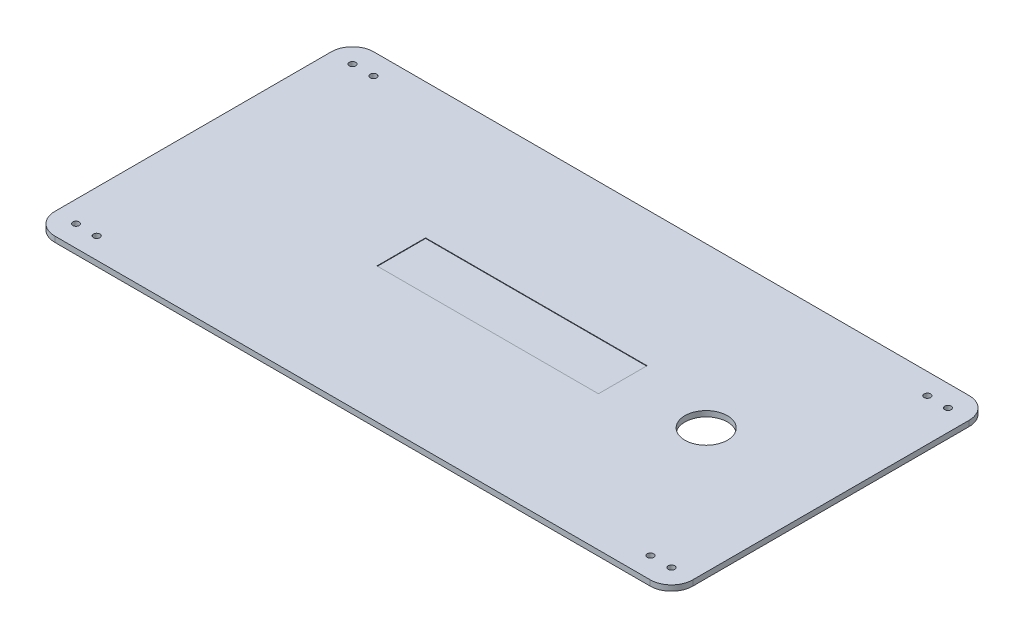
ISO-10303-21;
HEADER;
FILE_DESCRIPTION(('STEP AP214'),'2;1');
FILE_NAME('part.step','',(''),(''),'','','');
FILE_SCHEMA(('AUTOMOTIVE_DESIGN { 1 0 10303 214 1 1 1 1 }'));
ENDSEC;
DATA;
#1=APPLICATION_CONTEXT('core data for automotive mechanical design processes');
#2=APPLICATION_PROTOCOL_DEFINITION('international standard','automotive_design',2000,#1);
#3=PRODUCT_CONTEXT('',#1,'mechanical');
#4=PRODUCT('Part','Part','',(#3));
#5=PRODUCT_RELATED_PRODUCT_CATEGORY('part','',(#4));
#6=PRODUCT_DEFINITION_FORMATION('','',#4);
#7=PRODUCT_DEFINITION_CONTEXT('part definition',#1,'design');
#8=PRODUCT_DEFINITION('design','',#6,#7);
#9=PRODUCT_DEFINITION_SHAPE('','',#8);
#10=(LENGTH_UNIT() NAMED_UNIT(*) SI_UNIT(.MILLI.,.METRE.));
#11=(NAMED_UNIT(*) PLANE_ANGLE_UNIT() SI_UNIT($,.RADIAN.));
#12=(NAMED_UNIT(*) SI_UNIT($,.STERADIAN.) SOLID_ANGLE_UNIT());
#13=UNCERTAINTY_MEASURE_WITH_UNIT(LENGTH_MEASURE(1.E-05),#10,'distance_accuracy_value','');
#14=(GEOMETRIC_REPRESENTATION_CONTEXT(3) GLOBAL_UNCERTAINTY_ASSIGNED_CONTEXT((#13)) GLOBAL_UNIT_ASSIGNED_CONTEXT((#10,
#11,#12)) REPRESENTATION_CONTEXT('',''));
#15=CARTESIAN_POINT('',(0.,0.,0.));
#16=DIRECTION('',(0.,0.,1.));
#17=DIRECTION('',(1.,0.,0.));
#18=AXIS2_PLACEMENT_3D('',#15,#16,#17);
#19=CARTESIAN_POINT('',(0.,2.6,0.));
#20=DIRECTION('',(1.,0.,0.));
#21=DIRECTION('',(0.,0.,-1.));
#22=AXIS2_PLACEMENT_3D('',#19,#20,#21);
#23=PLANE('',#22);
#24=DIRECTION('',(0.,0.,1.));
#25=VECTOR('',#24,1.);
#26=CARTESIAN_POINT('',(0.,2.6,0.));
#27=LINE('',#26,#25);
#28=CARTESIAN_POINT('',(0.,2.6,10.));
#29=VERTEX_POINT('',#28);
#30=CARTESIAN_POINT('',(0.,2.6,140.));
#31=VERTEX_POINT('',#30);
#32=EDGE_CURVE('E221',#29,#31,#27,.T.);
#33=ORIENTED_EDGE('',*,*,#32,.F.);
#34=DIRECTION('',(0.,-1.,0.));
#35=VECTOR('',#34,1.);
#36=CARTESIAN_POINT('',(0.,0.,10.));
#37=LINE('',#36,#35);
#38=CARTESIAN_POINT('',(0.,0.,10.));
#39=VERTEX_POINT('',#38);
#40=EDGE_CURVE('E244',#29,#39,#37,.T.);
#41=ORIENTED_EDGE('',*,*,#40,.T.);
#42=DIRECTION('',(0.,0.,1.));
#43=VECTOR('',#42,1.);
#44=CARTESIAN_POINT('',(0.,0.,0.));
#45=LINE('',#44,#43);
#46=CARTESIAN_POINT('',(0.,0.,140.));
#47=VERTEX_POINT('',#46);
#48=EDGE_CURVE('E218',#39,#47,#45,.T.);
#49=ORIENTED_EDGE('',*,*,#48,.T.);
#50=DIRECTION('',(0.,-1.,0.));
#51=VECTOR('',#50,1.);
#52=CARTESIAN_POINT('',(0.,2.6,140.));
#53=LINE('',#52,#51);
#54=EDGE_CURVE('E232',#47,#31,#53,.F.);
#55=ORIENTED_EDGE('',*,*,#54,.T.);
#56=EDGE_LOOP('',(#33,#41,#49,#55));
#57=FACE_BOUND('',#56,.T.);
#58=ADVANCED_FACE('F37',(#57),#23,.F.);
#59=CARTESIAN_POINT('',(0.,2.6,150.));
#60=DIRECTION('',(0.,0.,-1.));
#61=DIRECTION('',(-1.,0.,0.));
#62=AXIS2_PLACEMENT_3D('',#59,#60,#61);
#63=PLANE('',#62);
#64=DIRECTION('',(1.,0.,0.));
#65=VECTOR('',#64,1.);
#66=CARTESIAN_POINT('',(0.,2.6,150.));
#67=LINE('',#66,#65);
#68=CARTESIAN_POINT('',(10.,2.6,150.));
#69=VERTEX_POINT('',#68);
#70=CARTESIAN_POINT('',(290.,2.6,150.));
#71=VERTEX_POINT('',#70);
#72=EDGE_CURVE('E224',#69,#71,#67,.T.);
#73=ORIENTED_EDGE('',*,*,#72,.F.);
#74=DIRECTION('',(0.,-1.,0.));
#75=VECTOR('',#74,1.);
#76=CARTESIAN_POINT('',(10.,2.6,150.));
#77=LINE('',#76,#75);
#78=CARTESIAN_POINT('',(10.,0.,150.));
#79=VERTEX_POINT('',#78);
#80=EDGE_CURVE('E269',#69,#79,#77,.T.);
#81=ORIENTED_EDGE('',*,*,#80,.T.);
#82=DIRECTION('',(1.,0.,0.));
#83=VECTOR('',#82,1.);
#84=CARTESIAN_POINT('',(0.,0.,150.));
#85=LINE('',#84,#83);
#86=CARTESIAN_POINT('',(290.,0.,150.));
#87=VERTEX_POINT('',#86);
#88=EDGE_CURVE('E235',#79,#87,#85,.T.);
#89=ORIENTED_EDGE('',*,*,#88,.T.);
#90=DIRECTION('',(0.,-1.,0.));
#91=VECTOR('',#90,1.);
#92=CARTESIAN_POINT('',(290.,2.6,150.));
#93=LINE('',#92,#91);
#94=EDGE_CURVE('E267',#87,#71,#93,.F.);
#95=ORIENTED_EDGE('',*,*,#94,.T.);
#96=EDGE_LOOP('',(#73,#81,#89,#95));
#97=FACE_BOUND('',#96,.T.);
#98=ADVANCED_FACE('F302',(#97),#63,.F.);
#99=CARTESIAN_POINT('',(300.,2.6,0.));
#100=DIRECTION('',(1.,0.,0.));
#101=DIRECTION('',(0.,0.,-1.));
#102=AXIS2_PLACEMENT_3D('',#99,#100,#101);
#103=PLANE('',#102);
#104=DIRECTION('',(0.,0.,1.));
#105=VECTOR('',#104,1.);
#106=CARTESIAN_POINT('',(300.,2.6,0.));
#107=LINE('',#106,#105);
#108=CARTESIAN_POINT('',(300.,2.6,10.));
#109=VERTEX_POINT('',#108);
#110=CARTESIAN_POINT('',(300.,2.6,140.));
#111=VERTEX_POINT('',#110);
#112=EDGE_CURVE('E227',#109,#111,#107,.T.);
#113=ORIENTED_EDGE('',*,*,#112,.T.);
#114=DIRECTION('',(0.,-1.,0.));
#115=VECTOR('',#114,1.);
#116=CARTESIAN_POINT('',(300.,0.,140.));
#117=LINE('',#116,#115);
#118=CARTESIAN_POINT('',(300.,0.,140.));
#119=VERTEX_POINT('',#118);
#120=EDGE_CURVE('E11',#111,#119,#117,.T.);
#121=ORIENTED_EDGE('',*,*,#120,.T.);
#122=DIRECTION('',(0.,0.,1.));
#123=VECTOR('',#122,1.);
#124=CARTESIAN_POINT('',(300.,0.,0.));
#125=LINE('',#124,#123);
#126=CARTESIAN_POINT('',(300.,0.,10.));
#127=VERTEX_POINT('',#126);
#128=EDGE_CURVE('E238',#127,#119,#125,.T.);
#129=ORIENTED_EDGE('',*,*,#128,.F.);
#130=DIRECTION('',(0.,-1.,0.));
#131=VECTOR('',#130,1.);
#132=CARTESIAN_POINT('',(300.,2.6,10.));
#133=LINE('',#132,#131);
#134=EDGE_CURVE('E45',#127,#109,#133,.F.);
#135=ORIENTED_EDGE('',*,*,#134,.T.);
#136=EDGE_LOOP('',(#113,#121,#129,#135));
#137=FACE_BOUND('',#136,.T.);
#138=ADVANCED_FACE('F274',(#137),#103,.T.);
#139=CARTESIAN_POINT('',(0.,2.6,0.));
#140=DIRECTION('',(0.,0.,-1.));
#141=DIRECTION('',(-1.,0.,0.));
#142=AXIS2_PLACEMENT_3D('',#139,#140,#141);
#143=PLANE('',#142);
#144=DIRECTION('',(1.,0.,0.));
#145=VECTOR('',#144,1.);
#146=CARTESIAN_POINT('',(0.,0.,0.));
#147=LINE('',#146,#145);
#148=CARTESIAN_POINT('',(10.,0.,0.));
#149=VERTEX_POINT('',#148);
#150=CARTESIAN_POINT('',(290.,0.,0.));
#151=VERTEX_POINT('',#150);
#152=EDGE_CURVE('E225',#149,#151,#147,.T.);
#153=ORIENTED_EDGE('',*,*,#152,.F.);
#154=DIRECTION('',(0.,-1.,0.));
#155=VECTOR('',#154,1.);
#156=CARTESIAN_POINT('',(10.,2.6,0.));
#157=LINE('',#156,#155);
#158=CARTESIAN_POINT('',(10.,2.6,0.));
#159=VERTEX_POINT('',#158);
#160=EDGE_CURVE('E258',#149,#159,#157,.F.);
#161=ORIENTED_EDGE('',*,*,#160,.T.);
#162=DIRECTION('',(1.,0.,0.));
#163=VECTOR('',#162,1.);
#164=CARTESIAN_POINT('',(0.,2.6,0.));
#165=LINE('',#164,#163);
#166=CARTESIAN_POINT('',(290.,2.6,0.));
#167=VERTEX_POINT('',#166);
#168=EDGE_CURVE('E229',#159,#167,#165,.T.);
#169=ORIENTED_EDGE('',*,*,#168,.T.);
#170=DIRECTION('',(0.,-1.,0.));
#171=VECTOR('',#170,1.);
#172=CARTESIAN_POINT('',(290.,2.6,0.));
#173=LINE('',#172,#171);
#174=EDGE_CURVE('E255',#167,#151,#173,.T.);
#175=ORIENTED_EDGE('',*,*,#174,.T.);
#176=EDGE_LOOP('',(#153,#161,#169,#175));
#177=FACE_BOUND('',#176,.T.);
#178=ADVANCED_FACE('F283',(#177),#143,.T.);
#179=CARTESIAN_POINT('',(0.,2.6,0.));
#180=DIRECTION('',(0.,1.,0.));
#181=DIRECTION('',(0.,0.,1.));
#182=AXIS2_PLACEMENT_3D('',#179,#180,#181);
#183=PLANE('',#182);
#184=DIRECTION('',(0.,0.,-1.));
#185=VECTOR('',#184,1.);
#186=CARTESIAN_POINT('',(202.07,2.6,86.43));
#187=LINE('',#186,#185);
#188=CARTESIAN_POINT('',(202.07,2.6,86.43));
#189=VERTEX_POINT('',#188);
#190=CARTESIAN_POINT('',(202.07,2.6,63.57));
#191=VERTEX_POINT('',#190);
#192=EDGE_CURVE('E52',#189,#191,#187,.T.);
#193=ORIENTED_EDGE('',*,*,#192,.F.);
#194=DIRECTION('',(1.,0.,0.));
#195=VECTOR('',#194,1.);
#196=CARTESIAN_POINT('',(97.93,2.6,86.43));
#197=LINE('',#196,#195);
#198=CARTESIAN_POINT('',(97.93,2.6,86.43));
#199=VERTEX_POINT('',#198);
#200=EDGE_CURVE('E148',#199,#189,#197,.T.);
#201=ORIENTED_EDGE('',*,*,#200,.F.);
#202=DIRECTION('',(0.,0.,1.));
#203=VECTOR('',#202,1.);
#204=CARTESIAN_POINT('',(97.93,2.6,86.43));
#205=LINE('',#204,#203);
#206=CARTESIAN_POINT('',(97.93,2.6,63.57));
#207=VERTEX_POINT('',#206);
#208=EDGE_CURVE('E151',#207,#199,#205,.T.);
#209=ORIENTED_EDGE('',*,*,#208,.F.);
#210=DIRECTION('',(-1.,0.,0.));
#211=VECTOR('',#210,1.);
#212=CARTESIAN_POINT('',(97.93,2.6,63.57));
#213=LINE('',#212,#211);
#214=EDGE_CURVE('E157',#191,#207,#213,.T.);
#215=ORIENTED_EDGE('',*,*,#214,.F.);
#216=EDGE_LOOP('',(#193,#201,#209,#215));
#217=FACE_BOUND('',#216,.T.);
#218=CARTESIAN_POINT('',(241.3,2.6,75.));
#219=DIRECTION('',(0.,-1.,0.));
#220=DIRECTION('',(0.,0.,-1.));
#221=AXIS2_PLACEMENT_3D('',#218,#219,#220);
#222=CIRCLE('',#221,10.0000000000001);
#223=CARTESIAN_POINT('',(241.3,2.6,64.9999999999999));
#224=VERTEX_POINT('',#223);
#225=EDGE_CURVE('E167',#224,#224,#222,.T.);
#226=ORIENTED_EDGE('',*,*,#225,.T.);
#227=EDGE_LOOP('',(#226));
#228=FACE_BOUND('',#227,.T.);
#229=CARTESIAN_POINT('',(19.812,2.6,140.094));
#230=DIRECTION('',(0.,-1.,0.));
#231=DIRECTION('',(0.,0.,-1.));
#232=AXIS2_PLACEMENT_3D('',#229,#230,#231);
#233=CIRCLE('',#232,1.524);
#234=CARTESIAN_POINT('',(19.812,2.6,138.57));
#235=VERTEX_POINT('',#234);
#236=EDGE_CURVE('E170',#235,#235,#233,.T.);
#237=ORIENTED_EDGE('',*,*,#236,.T.);
#238=EDGE_LOOP('',(#237));
#239=FACE_BOUND('',#238,.T.);
#240=CARTESIAN_POINT('',(280.188,2.6,140.094));
#241=DIRECTION('',(0.,1.,0.));
#242=DIRECTION('',(0.,0.,-1.));
#243=AXIS2_PLACEMENT_3D('',#240,#241,#242);
#244=CIRCLE('',#243,1.524);
#245=CARTESIAN_POINT('',(280.188,2.6,138.57));
#246=VERTEX_POINT('',#245);
#247=EDGE_CURVE('E176',#246,#246,#244,.T.);
#248=ORIENTED_EDGE('',*,*,#247,.F.);
#249=EDGE_LOOP('',(#248));
#250=FACE_BOUND('',#249,.T.);
#251=CARTESIAN_POINT('',(280.188,2.6,9.90599999999998));
#252=DIRECTION('',(0.,-1.,0.));
#253=DIRECTION('',(0.,0.,1.));
#254=AXIS2_PLACEMENT_3D('',#251,#252,#253);
#255=CIRCLE('',#254,1.524);
#256=CARTESIAN_POINT('',(280.188,2.6,11.43));
#257=VERTEX_POINT('',#256);
#258=EDGE_CURVE('E182',#257,#257,#255,.T.);
#259=ORIENTED_EDGE('',*,*,#258,.T.);
#260=EDGE_LOOP('',(#259));
#261=FACE_BOUND('',#260,.T.);
#262=CARTESIAN_POINT('',(19.812,2.6,9.906));
#263=DIRECTION('',(0.,1.,0.));
#264=DIRECTION('',(0.,0.,1.));
#265=AXIS2_PLACEMENT_3D('',#262,#263,#264);
#266=CIRCLE('',#265,1.524);
#267=CARTESIAN_POINT('',(19.812,2.6,11.43));
#268=VERTEX_POINT('',#267);
#269=EDGE_CURVE('E188',#268,#268,#266,.T.);
#270=ORIENTED_EDGE('',*,*,#269,.F.);
#271=EDGE_LOOP('',(#270));
#272=FACE_BOUND('',#271,.T.);
#273=CARTESIAN_POINT('',(290.,2.6,140.));
#274=DIRECTION('',(0.,1.,0.));
#275=DIRECTION('',(0.,0.,1.));
#276=AXIS2_PLACEMENT_3D('',#273,#274,#275);
#277=CIRCLE('',#276,1.50000000000002);
#278=CARTESIAN_POINT('',(290.,2.6,141.5));
#279=VERTEX_POINT('',#278);
#280=EDGE_CURVE('E197',#279,#279,#277,.T.);
#281=ORIENTED_EDGE('',*,*,#280,.F.);
#282=EDGE_LOOP('',(#281));
#283=FACE_BOUND('',#282,.T.);
#284=CARTESIAN_POINT('',(10.,2.6,140.));
#285=DIRECTION('',(0.,-1.,0.));
#286=DIRECTION('',(0.,0.,1.));
#287=AXIS2_PLACEMENT_3D('',#284,#285,#286);
#288=CIRCLE('',#287,1.50000000000002);
#289=CARTESIAN_POINT('',(10.,2.6,141.5));
#290=VERTEX_POINT('',#289);
#291=EDGE_CURVE('E203',#290,#290,#288,.T.);
#292=ORIENTED_EDGE('',*,*,#291,.T.);
#293=EDGE_LOOP('',(#292));
#294=FACE_BOUND('',#293,.T.);
#295=CARTESIAN_POINT('',(10.,2.6,10.));
#296=DIRECTION('',(0.,1.,0.));
#297=DIRECTION('',(0.,0.,-1.));
#298=AXIS2_PLACEMENT_3D('',#295,#296,#297);
#299=CIRCLE('',#298,1.50000000000002);
#300=CARTESIAN_POINT('',(10.,2.6,8.49999999999999));
#301=VERTEX_POINT('',#300);
#302=EDGE_CURVE('E209',#301,#301,#299,.T.);
#303=ORIENTED_EDGE('',*,*,#302,.F.);
#304=EDGE_LOOP('',(#303));
#305=FACE_BOUND('',#304,.T.);
#306=CARTESIAN_POINT('',(290.,2.6,10.));
#307=DIRECTION('',(0.,-1.,0.));
#308=DIRECTION('',(0.,0.,-1.));
#309=AXIS2_PLACEMENT_3D('',#306,#307,#308);
#310=CIRCLE('',#309,1.50000000000002);
#311=CARTESIAN_POINT('',(290.,2.6,8.49999999999998));
#312=VERTEX_POINT('',#311);
#313=EDGE_CURVE('E215',#312,#312,#310,.T.);
#314=ORIENTED_EDGE('',*,*,#313,.T.);
#315=EDGE_LOOP('',(#314));
#316=FACE_BOUND('',#315,.T.);
#317=ORIENTED_EDGE('',*,*,#168,.F.);
#318=CARTESIAN_POINT('',(10.,2.6,10.));
#319=DIRECTION('',(0.,1.,0.));
#320=DIRECTION('',(0.,0.,1.));
#321=AXIS2_PLACEMENT_3D('',#318,#319,#320);
#322=CIRCLE('',#321,10.);
#323=EDGE_CURVE('E265',#159,#29,#322,.T.);
#324=ORIENTED_EDGE('',*,*,#323,.T.);
#325=ORIENTED_EDGE('',*,*,#32,.T.);
#326=CARTESIAN_POINT('',(10.,2.6,140.));
#327=DIRECTION('',(0.,1.,0.));
#328=DIRECTION('',(0.,0.,1.));
#329=AXIS2_PLACEMENT_3D('',#326,#327,#328);
#330=CIRCLE('',#329,10.);
#331=EDGE_CURVE('E263',#31,#69,#330,.T.);
#332=ORIENTED_EDGE('',*,*,#331,.T.);
#333=ORIENTED_EDGE('',*,*,#72,.T.);
#334=CARTESIAN_POINT('',(290.,2.6,140.));
#335=DIRECTION('',(0.,1.,0.));
#336=DIRECTION('',(0.,0.,1.));
#337=AXIS2_PLACEMENT_3D('',#334,#335,#336);
#338=CIRCLE('',#337,10.);
#339=EDGE_CURVE('E60',#71,#111,#338,.T.);
#340=ORIENTED_EDGE('',*,*,#339,.T.);
#341=ORIENTED_EDGE('',*,*,#112,.F.);
#342=CARTESIAN_POINT('',(290.,2.6,10.));
#343=DIRECTION('',(0.,1.,0.));
#344=DIRECTION('',(0.,0.,1.));
#345=AXIS2_PLACEMENT_3D('',#342,#343,#344);
#346=CIRCLE('',#345,10.);
#347=EDGE_CURVE('E260',#109,#167,#346,.T.);
#348=ORIENTED_EDGE('',*,*,#347,.T.);
#349=EDGE_LOOP('',(#317,#324,#325,#332,#333,#340,#341,#348));
#350=FACE_BOUND('',#349,.T.);
#351=ADVANCED_FACE('F279',(#217,#228,#239,#250,#261,#272,#283,#294,#305,#316,#350),#183,.T.);
#352=CARTESIAN_POINT('',(0.,0.,0.));
#353=DIRECTION('',(0.,1.,0.));
#354=DIRECTION('',(0.,0.,1.));
#355=AXIS2_PLACEMENT_3D('',#352,#353,#354);
#356=PLANE('',#355);
#357=CARTESIAN_POINT('',(241.3,0.,75.));
#358=DIRECTION('',(0.,-1.,0.));
#359=DIRECTION('',(0.,0.,-1.));
#360=AXIS2_PLACEMENT_3D('',#357,#358,#359);
#361=CIRCLE('',#360,10.0000000000001);
#362=CARTESIAN_POINT('',(241.3,0.,64.9999999999999));
#363=VERTEX_POINT('',#362);
#364=EDGE_CURVE('E163',#363,#363,#361,.T.);
#365=ORIENTED_EDGE('',*,*,#364,.F.);
#366=EDGE_LOOP('',(#365));
#367=FACE_BOUND('',#366,.T.);
#368=CARTESIAN_POINT('',(19.812,1.19999999954185E-07,140.094));
#369=DIRECTION('',(0.,-1.,0.));
#370=DIRECTION('',(0.,0.,-1.));
#371=AXIS2_PLACEMENT_3D('',#368,#369,#370);
#372=CIRCLE('',#371,1.524);
#373=CARTESIAN_POINT('',(19.812,1.19999999954185E-07,138.57));
#374=VERTEX_POINT('',#373);
#375=EDGE_CURVE('E173',#374,#374,#372,.T.);
#376=ORIENTED_EDGE('',*,*,#375,.F.);
#377=EDGE_LOOP('',(#376));
#378=FACE_BOUND('',#377,.T.);
#379=CARTESIAN_POINT('',(280.188,1.19999999954185E-07,140.094));
#380=DIRECTION('',(0.,1.,0.));
#381=DIRECTION('',(0.,0.,-1.));
#382=AXIS2_PLACEMENT_3D('',#379,#380,#381);
#383=CIRCLE('',#382,1.524);
#384=CARTESIAN_POINT('',(280.188,1.19999999954185E-07,138.57));
#385=VERTEX_POINT('',#384);
#386=EDGE_CURVE('E179',#385,#385,#383,.T.);
#387=ORIENTED_EDGE('',*,*,#386,.T.);
#388=EDGE_LOOP('',(#387));
#389=FACE_BOUND('',#388,.T.);
#390=CARTESIAN_POINT('',(280.188,1.19999999954185E-07,9.90599999999998));
#391=DIRECTION('',(0.,-1.,0.));
#392=DIRECTION('',(0.,0.,1.));
#393=AXIS2_PLACEMENT_3D('',#390,#391,#392);
#394=CIRCLE('',#393,1.524);
#395=CARTESIAN_POINT('',(280.188,1.19999999954185E-07,11.43));
#396=VERTEX_POINT('',#395);
#397=EDGE_CURVE('E185',#396,#396,#394,.T.);
#398=ORIENTED_EDGE('',*,*,#397,.F.);
#399=EDGE_LOOP('',(#398));
#400=FACE_BOUND('',#399,.T.);
#401=CARTESIAN_POINT('',(19.812,1.19999999954185E-07,9.906));
#402=DIRECTION('',(0.,1.,0.));
#403=DIRECTION('',(0.,0.,1.));
#404=AXIS2_PLACEMENT_3D('',#401,#402,#403);
#405=CIRCLE('',#404,1.524);
#406=CARTESIAN_POINT('',(19.812,1.19999999954185E-07,11.43));
#407=VERTEX_POINT('',#406);
#408=EDGE_CURVE('E191',#407,#407,#405,.T.);
#409=ORIENTED_EDGE('',*,*,#408,.T.);
#410=EDGE_LOOP('',(#409));
#411=FACE_BOUND('',#410,.T.);
#412=CARTESIAN_POINT('',(290.,0.,140.));
#413=DIRECTION('',(0.,1.,0.));
#414=DIRECTION('',(0.,0.,1.));
#415=AXIS2_PLACEMENT_3D('',#412,#413,#414);
#416=CIRCLE('',#415,1.50000000000002);
#417=CARTESIAN_POINT('',(290.,0.,141.5));
#418=VERTEX_POINT('',#417);
#419=EDGE_CURVE('E194',#418,#418,#416,.T.);
#420=ORIENTED_EDGE('',*,*,#419,.T.);
#421=EDGE_LOOP('',(#420));
#422=FACE_BOUND('',#421,.T.);
#423=CARTESIAN_POINT('',(10.,0.,140.));
#424=DIRECTION('',(0.,-1.,0.));
#425=DIRECTION('',(0.,0.,1.));
#426=AXIS2_PLACEMENT_3D('',#423,#424,#425);
#427=CIRCLE('',#426,1.50000000000002);
#428=CARTESIAN_POINT('',(10.,0.,141.5));
#429=VERTEX_POINT('',#428);
#430=EDGE_CURVE('E200',#429,#429,#427,.T.);
#431=ORIENTED_EDGE('',*,*,#430,.F.);
#432=EDGE_LOOP('',(#431));
#433=FACE_BOUND('',#432,.T.);
#434=CARTESIAN_POINT('',(10.,0.,10.));
#435=DIRECTION('',(0.,1.,0.));
#436=DIRECTION('',(0.,0.,-1.));
#437=AXIS2_PLACEMENT_3D('',#434,#435,#436);
#438=CIRCLE('',#437,1.50000000000002);
#439=CARTESIAN_POINT('',(10.,0.,8.49999999999999));
#440=VERTEX_POINT('',#439);
#441=EDGE_CURVE('E206',#440,#440,#438,.T.);
#442=ORIENTED_EDGE('',*,*,#441,.T.);
#443=EDGE_LOOP('',(#442));
#444=FACE_BOUND('',#443,.T.);
#445=CARTESIAN_POINT('',(290.,0.,10.));
#446=DIRECTION('',(0.,-1.,0.));
#447=DIRECTION('',(0.,0.,-1.));
#448=AXIS2_PLACEMENT_3D('',#445,#446,#447);
#449=CIRCLE('',#448,1.50000000000002);
#450=CARTESIAN_POINT('',(290.,0.,8.49999999999998));
#451=VERTEX_POINT('',#450);
#452=EDGE_CURVE('E212',#451,#451,#449,.T.);
#453=ORIENTED_EDGE('',*,*,#452,.F.);
#454=EDGE_LOOP('',(#453));
#455=FACE_BOUND('',#454,.T.);
#456=ORIENTED_EDGE('',*,*,#48,.F.);
#457=CARTESIAN_POINT('',(10.,0.,10.));
#458=DIRECTION('',(0.,1.,0.));
#459=DIRECTION('',(0.,0.,1.));
#460=AXIS2_PLACEMENT_3D('',#457,#458,#459);
#461=CIRCLE('',#460,10.);
#462=EDGE_CURVE('E253',#39,#149,#461,.F.);
#463=ORIENTED_EDGE('',*,*,#462,.T.);
#464=ORIENTED_EDGE('',*,*,#152,.T.);
#465=CARTESIAN_POINT('',(290.,0.,10.));
#466=DIRECTION('',(0.,1.,0.));
#467=DIRECTION('',(0.,0.,1.));
#468=AXIS2_PLACEMENT_3D('',#465,#466,#467);
#469=CIRCLE('',#468,10.);
#470=EDGE_CURVE('E247',#151,#127,#469,.F.);
#471=ORIENTED_EDGE('',*,*,#470,.T.);
#472=ORIENTED_EDGE('',*,*,#128,.T.);
#473=CARTESIAN_POINT('',(290.,0.,140.));
#474=DIRECTION('',(0.,1.,0.));
#475=DIRECTION('',(0.,0.,1.));
#476=AXIS2_PLACEMENT_3D('',#473,#474,#475);
#477=CIRCLE('',#476,10.);
#478=EDGE_CURVE('E249',#119,#87,#477,.F.);
#479=ORIENTED_EDGE('',*,*,#478,.T.);
#480=ORIENTED_EDGE('',*,*,#88,.F.);
#481=CARTESIAN_POINT('',(10.,0.,140.));
#482=DIRECTION('',(0.,1.,0.));
#483=DIRECTION('',(0.,0.,1.));
#484=AXIS2_PLACEMENT_3D('',#481,#482,#483);
#485=CIRCLE('',#484,10.);
#486=EDGE_CURVE('E251',#79,#47,#485,.F.);
#487=ORIENTED_EDGE('',*,*,#486,.T.);
#488=EDGE_LOOP('',(#456,#463,#464,#471,#472,#479,#480,#487));
#489=FACE_BOUND('',#488,.T.);
#490=ADVANCED_FACE('F287',(#367,#378,#389,#400,#411,#422,#433,#444,#455,#489),#356,.F.);
#491=CARTESIAN_POINT('',(10.,2.6,10.));
#492=DIRECTION('',(0.,1.,0.));
#493=DIRECTION('',(0.,0.,1.));
#494=AXIS2_PLACEMENT_3D('',#491,#492,#493);
#495=CYLINDRICAL_SURFACE('',#494,10.);
#496=ORIENTED_EDGE('',*,*,#323,.F.);
#497=ORIENTED_EDGE('',*,*,#160,.F.);
#498=ORIENTED_EDGE('',*,*,#462,.F.);
#499=ORIENTED_EDGE('',*,*,#40,.F.);
#500=EDGE_LOOP('',(#496,#497,#498,#499));
#501=FACE_BOUND('',#500,.T.);
#502=ADVANCED_FACE('F291',(#501),#495,.T.);
#503=CARTESIAN_POINT('',(10.,2.6,140.));
#504=DIRECTION('',(0.,-1.,0.));
#505=DIRECTION('',(0.,0.,-1.));
#506=AXIS2_PLACEMENT_3D('',#503,#504,#505);
#507=CYLINDRICAL_SURFACE('',#506,10.);
#508=ORIENTED_EDGE('',*,*,#331,.F.);
#509=ORIENTED_EDGE('',*,*,#54,.F.);
#510=ORIENTED_EDGE('',*,*,#486,.F.);
#511=ORIENTED_EDGE('',*,*,#80,.F.);
#512=EDGE_LOOP('',(#508,#509,#510,#511));
#513=FACE_BOUND('',#512,.T.);
#514=ADVANCED_FACE('F299',(#513),#507,.T.);
#515=CARTESIAN_POINT('',(290.,2.6,140.));
#516=DIRECTION('',(0.,1.,0.));
#517=DIRECTION('',(0.,0.,1.));
#518=AXIS2_PLACEMENT_3D('',#515,#516,#517);
#519=CYLINDRICAL_SURFACE('',#518,10.);
#520=ORIENTED_EDGE('',*,*,#339,.F.);
#521=ORIENTED_EDGE('',*,*,#94,.F.);
#522=ORIENTED_EDGE('',*,*,#478,.F.);
#523=ORIENTED_EDGE('',*,*,#120,.F.);
#524=EDGE_LOOP('',(#520,#521,#522,#523));
#525=FACE_BOUND('',#524,.T.);
#526=ADVANCED_FACE('F305',(#525),#519,.T.);
#527=CARTESIAN_POINT('',(290.,2.6,10.));
#528=DIRECTION('',(0.,-1.,0.));
#529=DIRECTION('',(0.,0.,-1.));
#530=AXIS2_PLACEMENT_3D('',#527,#528,#529);
#531=CYLINDRICAL_SURFACE('',#530,10.);
#532=ORIENTED_EDGE('',*,*,#347,.F.);
#533=ORIENTED_EDGE('',*,*,#134,.F.);
#534=ORIENTED_EDGE('',*,*,#470,.F.);
#535=ORIENTED_EDGE('',*,*,#174,.F.);
#536=EDGE_LOOP('',(#532,#533,#534,#535));
#537=FACE_BOUND('',#536,.T.);
#538=ADVANCED_FACE('F39',(#537),#531,.T.);
#539=CARTESIAN_POINT('',(290.,2.6,10.));
#540=DIRECTION('',(0.,-1.,0.));
#541=DIRECTION('',(0.,0.,-1.));
#542=AXIS2_PLACEMENT_3D('',#539,#540,#541);
#543=CYLINDRICAL_SURFACE('',#542,1.50000000000002);
#544=ORIENTED_EDGE('',*,*,#313,.F.);
#545=EDGE_LOOP('',(#544));
#546=FACE_BOUND('',#545,.T.);
#547=ORIENTED_EDGE('',*,*,#452,.T.);
#548=EDGE_LOOP('',(#547));
#549=FACE_BOUND('',#548,.T.);
#550=ADVANCED_FACE('F311',(#546,#549),#543,.F.);
#551=CARTESIAN_POINT('',(10.,2.6,10.));
#552=DIRECTION('',(0.,-1.,0.));
#553=DIRECTION('',(0.,0.,-1.));
#554=AXIS2_PLACEMENT_3D('',#551,#552,#553);
#555=CYLINDRICAL_SURFACE('',#554,1.50000000000002);
#556=ORIENTED_EDGE('',*,*,#302,.T.);
#557=EDGE_LOOP('',(#556));
#558=FACE_BOUND('',#557,.T.);
#559=ORIENTED_EDGE('',*,*,#441,.F.);
#560=EDGE_LOOP('',(#559));
#561=FACE_BOUND('',#560,.T.);
#562=ADVANCED_FACE('F430',(#558,#561),#555,.F.);
#563=CARTESIAN_POINT('',(10.,2.6,140.));
#564=DIRECTION('',(0.,-1.,0.));
#565=DIRECTION('',(0.,0.,-1.));
#566=AXIS2_PLACEMENT_3D('',#563,#564,#565);
#567=CYLINDRICAL_SURFACE('',#566,1.50000000000002);
#568=ORIENTED_EDGE('',*,*,#291,.F.);
#569=EDGE_LOOP('',(#568));
#570=FACE_BOUND('',#569,.T.);
#571=ORIENTED_EDGE('',*,*,#430,.T.);
#572=EDGE_LOOP('',(#571));
#573=FACE_BOUND('',#572,.T.);
#574=ADVANCED_FACE('F426',(#570,#573),#567,.F.);
#575=CARTESIAN_POINT('',(290.,2.6,140.));
#576=DIRECTION('',(0.,-1.,0.));
#577=DIRECTION('',(0.,0.,-1.));
#578=AXIS2_PLACEMENT_3D('',#575,#576,#577);
#579=CYLINDRICAL_SURFACE('',#578,1.50000000000002);
#580=ORIENTED_EDGE('',*,*,#280,.T.);
#581=EDGE_LOOP('',(#580));
#582=FACE_BOUND('',#581,.T.);
#583=ORIENTED_EDGE('',*,*,#419,.F.);
#584=EDGE_LOOP('',(#583));
#585=FACE_BOUND('',#584,.T.);
#586=ADVANCED_FACE('F422',(#582,#585),#579,.F.);
#587=CARTESIAN_POINT('',(19.812,1.19999999954185E-07,9.906));
#588=DIRECTION('',(0.,1.,0.));
#589=DIRECTION('',(0.,0.,1.));
#590=AXIS2_PLACEMENT_3D('',#587,#588,#589);
#591=CYLINDRICAL_SURFACE('',#590,1.524);
#592=ORIENTED_EDGE('',*,*,#408,.F.);
#593=EDGE_LOOP('',(#592));
#594=FACE_BOUND('',#593,.T.);
#595=ORIENTED_EDGE('',*,*,#269,.T.);
#596=EDGE_LOOP('',(#595));
#597=FACE_BOUND('',#596,.T.);
#598=ADVANCED_FACE('F418',(#594,#597),#591,.F.);
#599=CARTESIAN_POINT('',(280.188,1.19999999954185E-07,9.90599999999998));
#600=DIRECTION('',(0.,1.,0.));
#601=DIRECTION('',(0.,0.,1.));
#602=AXIS2_PLACEMENT_3D('',#599,#600,#601);
#603=CYLINDRICAL_SURFACE('',#602,1.524);
#604=ORIENTED_EDGE('',*,*,#397,.T.);
#605=EDGE_LOOP('',(#604));
#606=FACE_BOUND('',#605,.T.);
#607=ORIENTED_EDGE('',*,*,#258,.F.);
#608=EDGE_LOOP('',(#607));
#609=FACE_BOUND('',#608,.T.);
#610=ADVANCED_FACE('F414',(#606,#609),#603,.F.);
#611=CARTESIAN_POINT('',(280.188,1.19999999954185E-07,140.094));
#612=DIRECTION('',(0.,1.,0.));
#613=DIRECTION('',(0.,0.,1.));
#614=AXIS2_PLACEMENT_3D('',#611,#612,#613);
#615=CYLINDRICAL_SURFACE('',#614,1.524);
#616=ORIENTED_EDGE('',*,*,#386,.F.);
#617=EDGE_LOOP('',(#616));
#618=FACE_BOUND('',#617,.T.);
#619=ORIENTED_EDGE('',*,*,#247,.T.);
#620=EDGE_LOOP('',(#619));
#621=FACE_BOUND('',#620,.T.);
#622=ADVANCED_FACE('F410',(#618,#621),#615,.F.);
#623=CARTESIAN_POINT('',(19.812,1.19999999954185E-07,140.094));
#624=DIRECTION('',(0.,1.,0.));
#625=DIRECTION('',(0.,0.,1.));
#626=AXIS2_PLACEMENT_3D('',#623,#624,#625);
#627=CYLINDRICAL_SURFACE('',#626,1.524);
#628=ORIENTED_EDGE('',*,*,#375,.T.);
#629=EDGE_LOOP('',(#628));
#630=FACE_BOUND('',#629,.T.);
#631=ORIENTED_EDGE('',*,*,#236,.F.);
#632=EDGE_LOOP('',(#631));
#633=FACE_BOUND('',#632,.T.);
#634=ADVANCED_FACE('F406',(#630,#633),#627,.F.);
#635=CARTESIAN_POINT('',(241.3,2.6,75.));
#636=DIRECTION('',(0.,-1.,0.));
#637=DIRECTION('',(0.,0.,-1.));
#638=AXIS2_PLACEMENT_3D('',#635,#636,#637);
#639=CYLINDRICAL_SURFACE('',#638,10.0000000000001);
#640=ORIENTED_EDGE('',*,*,#225,.F.);
#641=EDGE_LOOP('',(#640));
#642=FACE_BOUND('',#641,.T.);
#643=ORIENTED_EDGE('',*,*,#364,.T.);
#644=EDGE_LOOP('',(#643));
#645=FACE_BOUND('',#644,.T.);
#646=ADVANCED_FACE('F357',(#642,#645),#639,.F.);
#647=CARTESIAN_POINT('',(202.07,2.346,86.43));
#648=DIRECTION('',(1.,0.,0.));
#649=DIRECTION('',(0.,0.,-1.));
#650=AXIS2_PLACEMENT_3D('',#647,#648,#649);
#651=PLANE('',#650);
#652=ORIENTED_EDGE('',*,*,#192,.T.);
#653=DIRECTION('',(0.,1.,0.));
#654=VECTOR('',#653,1.);
#655=CARTESIAN_POINT('',(202.07,2.346,63.57));
#656=LINE('',#655,#654);
#657=CARTESIAN_POINT('',(202.07,2.346,63.57));
#658=VERTEX_POINT('',#657);
#659=EDGE_CURVE('E126',#658,#191,#656,.T.);
#660=ORIENTED_EDGE('',*,*,#659,.F.);
#661=DIRECTION('',(0.,0.,-1.));
#662=VECTOR('',#661,1.);
#663=CARTESIAN_POINT('',(202.07,2.346,86.43));
#664=LINE('',#663,#662);
#665=CARTESIAN_POINT('',(202.07,2.346,86.43));
#666=VERTEX_POINT('',#665);
#667=EDGE_CURVE('E130',#666,#658,#664,.T.);
#668=ORIENTED_EDGE('',*,*,#667,.F.);
#669=DIRECTION('',(0.,1.,0.));
#670=VECTOR('',#669,1.);
#671=CARTESIAN_POINT('',(202.07,2.346,86.43));
#672=LINE('',#671,#670);
#673=EDGE_CURVE('E161',#666,#189,#672,.T.);
#674=ORIENTED_EDGE('',*,*,#673,.T.);
#675=EDGE_LOOP('',(#652,#660,#668,#674));
#676=FACE_BOUND('',#675,.T.);
#677=ADVANCED_FACE('F128',(#676),#651,.F.);
#678=CARTESIAN_POINT('',(97.93,2.346,86.43));
#679=DIRECTION('',(0.,0.,1.));
#680=DIRECTION('',(1.,0.,0.));
#681=AXIS2_PLACEMENT_3D('',#678,#679,#680);
#682=PLANE('',#681);
#683=ORIENTED_EDGE('',*,*,#200,.T.);
#684=ORIENTED_EDGE('',*,*,#673,.F.);
#685=DIRECTION('',(1.,0.,0.));
#686=VECTOR('',#685,1.);
#687=CARTESIAN_POINT('',(97.93,2.346,86.43));
#688=LINE('',#687,#686);
#689=CARTESIAN_POINT('',(97.93,2.346,86.43));
#690=VERTEX_POINT('',#689);
#691=EDGE_CURVE('E136',#690,#666,#688,.T.);
#692=ORIENTED_EDGE('',*,*,#691,.F.);
#693=DIRECTION('',(0.,1.,0.));
#694=VECTOR('',#693,1.);
#695=CARTESIAN_POINT('',(97.93,2.346,86.43));
#696=LINE('',#695,#694);
#697=EDGE_CURVE('E164',#690,#199,#696,.T.);
#698=ORIENTED_EDGE('',*,*,#697,.T.);
#699=EDGE_LOOP('',(#683,#684,#692,#698));
#700=FACE_BOUND('',#699,.T.);
#701=ADVANCED_FACE('F365',(#700),#682,.F.);
#702=CARTESIAN_POINT('',(97.93,2.346,86.43));
#703=DIRECTION('',(-1.,0.,0.));
#704=DIRECTION('',(0.,0.,1.));
#705=AXIS2_PLACEMENT_3D('',#702,#703,#704);
#706=PLANE('',#705);
#707=ORIENTED_EDGE('',*,*,#208,.T.);
#708=ORIENTED_EDGE('',*,*,#697,.F.);
#709=DIRECTION('',(0.,0.,1.));
#710=VECTOR('',#709,1.);
#711=CARTESIAN_POINT('',(97.93,2.346,86.43));
#712=LINE('',#711,#710);
#713=CARTESIAN_POINT('',(97.93,2.346,63.57));
#714=VERTEX_POINT('',#713);
#715=EDGE_CURVE('E144',#714,#690,#712,.T.);
#716=ORIENTED_EDGE('',*,*,#715,.F.);
#717=DIRECTION('',(0.,1.,0.));
#718=VECTOR('',#717,1.);
#719=CARTESIAN_POINT('',(97.93,2.346,63.57));
#720=LINE('',#719,#718);
#721=EDGE_CURVE('E135',#714,#207,#720,.T.);
#722=ORIENTED_EDGE('',*,*,#721,.T.);
#723=EDGE_LOOP('',(#707,#708,#716,#722));
#724=FACE_BOUND('',#723,.T.);
#725=ADVANCED_FACE('F374',(#724),#706,.F.);
#726=CARTESIAN_POINT('',(97.93,2.346,63.57));
#727=DIRECTION('',(0.,0.,-1.));
#728=DIRECTION('',(-1.,0.,0.));
#729=AXIS2_PLACEMENT_3D('',#726,#727,#728);
#730=PLANE('',#729);
#731=ORIENTED_EDGE('',*,*,#214,.T.);
#732=ORIENTED_EDGE('',*,*,#721,.F.);
#733=DIRECTION('',(-1.,0.,0.));
#734=VECTOR('',#733,1.);
#735=CARTESIAN_POINT('',(97.93,2.346,63.57));
#736=LINE('',#735,#734);
#737=EDGE_CURVE('E139',#658,#714,#736,.T.);
#738=ORIENTED_EDGE('',*,*,#737,.F.);
#739=ORIENTED_EDGE('',*,*,#659,.T.);
#740=EDGE_LOOP('',(#731,#732,#738,#739));
#741=FACE_BOUND('',#740,.T.);
#742=ADVANCED_FACE('F140',(#741),#730,.F.);
#743=CARTESIAN_POINT('',(0.,2.346,0.));
#744=DIRECTION('',(0.,-1.,0.));
#745=DIRECTION('',(0.,0.,-1.));
#746=AXIS2_PLACEMENT_3D('',#743,#744,#745);
#747=PLANE('',#746);
#748=ORIENTED_EDGE('',*,*,#667,.T.);
#749=ORIENTED_EDGE('',*,*,#737,.T.);
#750=ORIENTED_EDGE('',*,*,#715,.T.);
#751=ORIENTED_EDGE('',*,*,#691,.T.);
#752=EDGE_LOOP('',(#748,#749,#750,#751));
#753=FACE_BOUND('',#752,.T.);
#754=ADVANCED_FACE('F146',(#753),#747,.F.);
#755=CLOSED_SHELL('',(#58,#98,#138,#178,#351,#490,#502,#514,#526,#538,#550,#562,#574,#586,#598,
#610,#622,#634,#646,#677,#701,#725,#742,#754));
#756=MANIFOLD_SOLID_BREP('B2',#755);
#757=ADVANCED_BREP_SHAPE_REPRESENTATION('',(#18,#756),#14);
#758=SHAPE_DEFINITION_REPRESENTATION(#9,#757);
ENDSEC;
END-ISO-10303-21;
